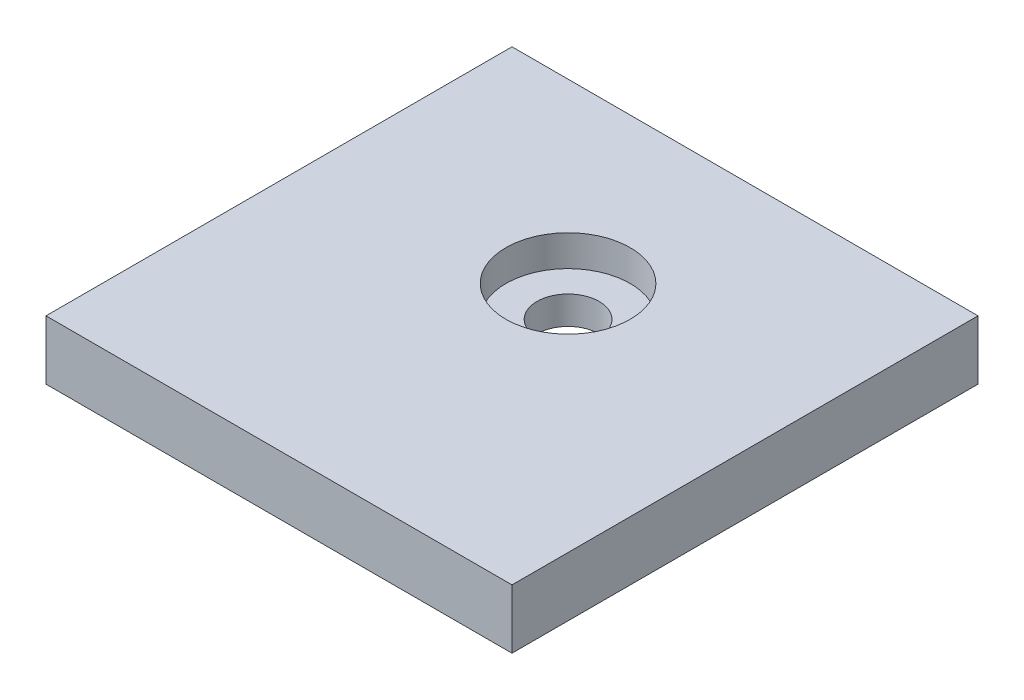
ISO-10303-21;
HEADER;
FILE_DESCRIPTION(('STEP AP214'),'2;1');
FILE_NAME('part.step','',(''),(''),'','','');
FILE_SCHEMA(('AUTOMOTIVE_DESIGN { 1 0 10303 214 1 1 1 1 }'));
ENDSEC;
DATA;
#1=APPLICATION_CONTEXT('core data for automotive mechanical design processes');
#2=APPLICATION_PROTOCOL_DEFINITION('international standard','automotive_design',2000,#1);
#3=PRODUCT_CONTEXT('',#1,'mechanical');
#4=PRODUCT('Part','Part','',(#3));
#5=PRODUCT_RELATED_PRODUCT_CATEGORY('part','',(#4));
#6=PRODUCT_DEFINITION_FORMATION('','',#4);
#7=PRODUCT_DEFINITION_CONTEXT('part definition',#1,'design');
#8=PRODUCT_DEFINITION('design','',#6,#7);
#9=PRODUCT_DEFINITION_SHAPE('','',#8);
#10=(LENGTH_UNIT() NAMED_UNIT(*) SI_UNIT(.MILLI.,.METRE.));
#11=(NAMED_UNIT(*) PLANE_ANGLE_UNIT() SI_UNIT($,.RADIAN.));
#12=(NAMED_UNIT(*) SI_UNIT($,.STERADIAN.) SOLID_ANGLE_UNIT());
#13=UNCERTAINTY_MEASURE_WITH_UNIT(LENGTH_MEASURE(1.E-05),#10,'distance_accuracy_value','');
#14=(GEOMETRIC_REPRESENTATION_CONTEXT(3) GLOBAL_UNCERTAINTY_ASSIGNED_CONTEXT((#13)) GLOBAL_UNIT_ASSIGNED_CONTEXT((#10,
#11,#12)) REPRESENTATION_CONTEXT('',''));
#15=CARTESIAN_POINT('',(0.,0.,0.));
#16=DIRECTION('',(0.,0.,1.));
#17=DIRECTION('',(1.,0.,0.));
#18=AXIS2_PLACEMENT_3D('',#15,#16,#17);
#19=CARTESIAN_POINT('',(0.,9.525,-9.02225882315077));
#20=DIRECTION('',(0.,-1.,0.));
#21=DIRECTION('',(0.,0.,-1.));
#22=AXIS2_PLACEMENT_3D('',#19,#20,#21);
#23=CYLINDRICAL_SURFACE('',#22,5.);
#24=CARTESIAN_POINT('',(0.,0.,-9.02225882315077));
#25=DIRECTION('',(0.,1.,0.));
#26=DIRECTION('',(0.,0.,1.));
#27=AXIS2_PLACEMENT_3D('',#24,#25,#26);
#28=CIRCLE('',#27,5.);
#29=CARTESIAN_POINT('',(0.,0.,-14.0222588231508));
#30=VERTEX_POINT('',#29);
#31=EDGE_CURVE('E102',#30,#30,#28,.T.);
#32=CARTESIAN_POINT('',(0.,4.525,-9.02225882315077));
#33=DIRECTION('',(0.,1.,0.));
#34=DIRECTION('',(0.,0.,1.));
#35=AXIS2_PLACEMENT_3D('',#32,#33,#34);
#36=CIRCLE('',#35,5.);
#37=CARTESIAN_POINT('',(0.,4.525,-14.0222588231508));
#38=VERTEX_POINT('',#37);
#39=EDGE_CURVE('E37',#38,#38,#36,.T.);
#40=CARTESIAN_POINT('',(0.,0.,-14.0222588231508));
#41=CARTESIAN_POINT('',(0.,0.0471354166666667,-14.0222588231508));
#42=CARTESIAN_POINT('',(0.,0.0942708333333334,-14.0222588231508));
#43=CARTESIAN_POINT('',(0.,0.188541666666667,-14.0222588231508));
#44=CARTESIAN_POINT('',(0.,0.235677083333333,-14.0222588231508));
#45=CARTESIAN_POINT('',(0.,0.329947916666667,-14.0222588231508));
#46=CARTESIAN_POINT('',(0.,0.377083333333333,-14.0222588231508));
#47=CARTESIAN_POINT('',(0.,0.471354166666667,-14.0222588231508));
#48=CARTESIAN_POINT('',(0.,0.518489583333334,-14.0222588231508));
#49=CARTESIAN_POINT('',(0.,0.612760416666667,-14.0222588231508));
#50=CARTESIAN_POINT('',(0.,0.659895833333334,-14.0222588231508));
#51=CARTESIAN_POINT('',(0.,0.754166666666667,-14.0222588231508));
#52=CARTESIAN_POINT('',(0.,0.801302083333334,-14.0222588231508));
#53=CARTESIAN_POINT('',(0.,0.895572916666667,-14.0222588231508));
#54=CARTESIAN_POINT('',(0.,0.942708333333334,-14.0222588231508));
#55=CARTESIAN_POINT('',(0.,1.03697916666667,-14.0222588231508));
#56=CARTESIAN_POINT('',(0.,1.08411458333333,-14.0222588231508));
#57=CARTESIAN_POINT('',(0.,1.17838541666667,-14.0222588231508));
#58=CARTESIAN_POINT('',(0.,1.22552083333333,-14.0222588231508));
#59=CARTESIAN_POINT('',(0.,1.31979166666667,-14.0222588231508));
#60=CARTESIAN_POINT('',(0.,1.36692708333333,-14.0222588231508));
#61=CARTESIAN_POINT('',(0.,1.46119791666667,-14.0222588231508));
#62=CARTESIAN_POINT('',(0.,1.50833333333333,-14.0222588231508));
#63=CARTESIAN_POINT('',(0.,1.60260416666667,-14.0222588231508));
#64=CARTESIAN_POINT('',(0.,1.64973958333333,-14.0222588231508));
#65=CARTESIAN_POINT('',(0.,1.74401041666667,-14.0222588231508));
#66=CARTESIAN_POINT('',(0.,1.79114583333333,-14.0222588231508));
#67=CARTESIAN_POINT('',(0.,1.88541666666667,-14.0222588231508));
#68=CARTESIAN_POINT('',(0.,1.93255208333333,-14.0222588231508));
#69=CARTESIAN_POINT('',(0.,2.02682291666667,-14.0222588231508));
#70=CARTESIAN_POINT('',(0.,2.07395833333333,-14.0222588231508));
#71=CARTESIAN_POINT('',(0.,2.16822916666667,-14.0222588231508));
#72=CARTESIAN_POINT('',(0.,2.21536458333333,-14.0222588231508));
#73=CARTESIAN_POINT('',(0.,2.30963541666667,-14.0222588231508));
#74=CARTESIAN_POINT('',(0.,2.35677083333333,-14.0222588231508));
#75=CARTESIAN_POINT('',(0.,2.45104166666667,-14.0222588231508));
#76=CARTESIAN_POINT('',(0.,2.49817708333333,-14.0222588231508));
#77=CARTESIAN_POINT('',(0.,2.59244791666667,-14.0222588231508));
#78=CARTESIAN_POINT('',(0.,2.63958333333333,-14.0222588231508));
#79=CARTESIAN_POINT('',(0.,2.73385416666667,-14.0222588231508));
#80=CARTESIAN_POINT('',(0.,2.78098958333333,-14.0222588231508));
#81=CARTESIAN_POINT('',(0.,2.87526041666667,-14.0222588231508));
#82=CARTESIAN_POINT('',(0.,2.92239583333333,-14.0222588231508));
#83=CARTESIAN_POINT('',(0.,3.01666666666667,-14.0222588231508));
#84=CARTESIAN_POINT('',(0.,3.06380208333333,-14.0222588231508));
#85=CARTESIAN_POINT('',(0.,3.15807291666667,-14.0222588231508));
#86=CARTESIAN_POINT('',(0.,3.20520833333333,-14.0222588231508));
#87=CARTESIAN_POINT('',(0.,3.29947916666667,-14.0222588231508));
#88=CARTESIAN_POINT('',(0.,3.34661458333333,-14.0222588231508));
#89=CARTESIAN_POINT('',(0.,3.44088541666667,-14.0222588231508));
#90=CARTESIAN_POINT('',(0.,3.48802083333333,-14.0222588231508));
#91=CARTESIAN_POINT('',(0.,3.58229166666667,-14.0222588231508));
#92=CARTESIAN_POINT('',(0.,3.62942708333333,-14.0222588231508));
#93=CARTESIAN_POINT('',(0.,3.72369791666667,-14.0222588231508));
#94=CARTESIAN_POINT('',(0.,3.77083333333333,-14.0222588231508));
#95=CARTESIAN_POINT('',(0.,3.86510416666667,-14.0222588231508));
#96=CARTESIAN_POINT('',(0.,3.91223958333333,-14.0222588231508));
#97=CARTESIAN_POINT('',(0.,4.00651041666667,-14.0222588231508));
#98=CARTESIAN_POINT('',(0.,4.05364583333333,-14.0222588231508));
#99=CARTESIAN_POINT('',(0.,4.14791666666667,-14.0222588231508));
#100=CARTESIAN_POINT('',(0.,4.19505208333333,-14.0222588231508));
#101=CARTESIAN_POINT('',(0.,4.28932291666667,-14.0222588231508));
#102=CARTESIAN_POINT('',(0.,4.33645833333333,-14.0222588231508));
#103=CARTESIAN_POINT('',(0.,4.43072916666667,-14.0222588231508));
#104=CARTESIAN_POINT('',(0.,4.47786458333333,-14.0222588231508));
#105=CARTESIAN_POINT('',(0.,4.525,-14.0222588231508));
#106=B_SPLINE_CURVE_WITH_KNOTS('',3,(#40,#41,#42,#43,#44,#45,#46,#47,#48,#49,#50,#51,#52,#53,
#54,#55,#56,#57,#58,#59,#60,#61,#62,#63,#64,#65,#66,#67,#68,#69,#70,#71,#72,#73,#74,#75,#76,#77,
#78,#79,#80,#81,#82,#83,#84,#85,#86,#87,#88,#89,#90,#91,#92,#93,#94,#95,#96,#97,#98,#99,#100,
#101,#102,#103,#104,#105),.UNSPECIFIED.,.F.,.F.,(4,2,2,2,2,2,2,2,2,2,2,2,2,2,2,2,2,2,2,2,2,2,2,
2,2,2,2,2,2,2,2,2,4),(0.,0.14140625,0.2828125,0.42421875,0.565625,0.70703125,0.8484375,
0.98984375,1.13125,1.27265625,1.4140625,1.55546875,1.696875,1.83828125,1.9796875,2.12109375,
2.2625,2.40390625,2.5453125,2.68671875,2.828125,2.96953125,3.1109375,3.25234375,3.39375,
3.53515625,3.6765625,3.81796875,3.959375,4.10078125,4.2421875,4.38359375,4.525),.UNSPECIFIED.);
#107=EDGE_CURVE('BSEAM33',#30,#38,#106,.T.);
#108=ORIENTED_EDGE('',*,*,#31,.F.);
#109=ORIENTED_EDGE('',*,*,#39,.T.);
#110=ORIENTED_EDGE('',*,*,#107,.T.);
#111=ORIENTED_EDGE('',*,*,#107,.F.);
#112=EDGE_LOOP('',(#108,#110,#109,#111));
#113=FACE_BOUND('',#112,.T.);
#114=ADVANCED_FACE('F33',(#113),#23,.F.);
#115=CARTESIAN_POINT('',(0.,9.525,0.));
#116=DIRECTION('',(0.,1.,0.));
#117=DIRECTION('',(0.,0.,1.));
#118=AXIS2_PLACEMENT_3D('',#115,#116,#117);
#119=PLANE('',#118);
#120=CARTESIAN_POINT('',(0.,9.525,-9.02225882315077));
#121=DIRECTION('',(0.,1.,0.));
#122=DIRECTION('',(0.,0.,1.));
#123=AXIS2_PLACEMENT_3D('',#120,#121,#122);
#124=CIRCLE('',#123,10.);
#125=CARTESIAN_POINT('',(0.,9.525,0.977741176849227));
#126=VERTEX_POINT('',#125);
#127=EDGE_CURVE('E116',#126,#126,#124,.T.);
#128=ORIENTED_EDGE('',*,*,#127,.F.);
#129=EDGE_LOOP('',(#128));
#130=FACE_BOUND('',#129,.T.);
#131=DIRECTION('',(0.,0.,1.));
#132=VECTOR('',#131,1.);
#133=CARTESIAN_POINT('',(-37.5,9.525,37.5));
#134=LINE('',#133,#132);
#135=CARTESIAN_POINT('',(-37.5,9.525,-37.5));
#136=VERTEX_POINT('',#135);
#137=CARTESIAN_POINT('',(-37.5,9.525,37.5));
#138=VERTEX_POINT('',#137);
#139=EDGE_CURVE('E86',#136,#138,#134,.T.);
#140=ORIENTED_EDGE('',*,*,#139,.T.);
#141=DIRECTION('',(1.,0.,0.));
#142=VECTOR('',#141,1.);
#143=CARTESIAN_POINT('',(37.5,9.525,37.5));
#144=LINE('',#143,#142);
#145=CARTESIAN_POINT('',(37.5,9.525,37.5));
#146=VERTEX_POINT('',#145);
#147=EDGE_CURVE('E81',#138,#146,#144,.T.);
#148=ORIENTED_EDGE('',*,*,#147,.T.);
#149=DIRECTION('',(0.,0.,-1.));
#150=VECTOR('',#149,1.);
#151=CARTESIAN_POINT('',(37.5,9.525,37.5));
#152=LINE('',#151,#150);
#153=CARTESIAN_POINT('',(37.5,9.525,-37.5));
#154=VERTEX_POINT('',#153);
#155=EDGE_CURVE('E84',#146,#154,#152,.T.);
#156=ORIENTED_EDGE('',*,*,#155,.T.);
#157=DIRECTION('',(-1.,0.,0.));
#158=VECTOR('',#157,1.);
#159=CARTESIAN_POINT('',(37.5,9.525,-37.5));
#160=LINE('',#159,#158);
#161=EDGE_CURVE('E51',#154,#136,#160,.T.);
#162=ORIENTED_EDGE('',*,*,#161,.T.);
#163=EDGE_LOOP('',(#140,#148,#156,#162));
#164=FACE_BOUND('',#163,.T.);
#165=ADVANCED_FACE('F82',(#130,#164),#119,.T.);
#166=CARTESIAN_POINT('',(0.,0.,0.));
#167=DIRECTION('',(0.,1.,0.));
#168=DIRECTION('',(0.,0.,1.));
#169=AXIS2_PLACEMENT_3D('',#166,#167,#168);
#170=PLANE('',#169);
#171=DIRECTION('',(0.,0.,1.));
#172=VECTOR('',#171,1.);
#173=CARTESIAN_POINT('',(-37.5,0.,37.5));
#174=LINE('',#173,#172);
#175=CARTESIAN_POINT('',(-37.5,0.,-37.5));
#176=VERTEX_POINT('',#175);
#177=CARTESIAN_POINT('',(-37.5,0.,37.5));
#178=VERTEX_POINT('',#177);
#179=EDGE_CURVE('E99',#176,#178,#174,.T.);
#180=ORIENTED_EDGE('',*,*,#179,.F.);
#181=DIRECTION('',(-1.,0.,0.));
#182=VECTOR('',#181,1.);
#183=CARTESIAN_POINT('',(37.5,0.,-37.5));
#184=LINE('',#183,#182);
#185=CARTESIAN_POINT('',(37.5,0.,-37.5));
#186=VERTEX_POINT('',#185);
#187=EDGE_CURVE('E74',#186,#176,#184,.T.);
#188=ORIENTED_EDGE('',*,*,#187,.F.);
#189=DIRECTION('',(0.,0.,-1.));
#190=VECTOR('',#189,1.);
#191=CARTESIAN_POINT('',(37.5,0.,37.5));
#192=LINE('',#191,#190);
#193=CARTESIAN_POINT('',(37.5,0.,37.5));
#194=VERTEX_POINT('',#193);
#195=EDGE_CURVE('E68',#194,#186,#192,.T.);
#196=ORIENTED_EDGE('',*,*,#195,.F.);
#197=DIRECTION('',(1.,0.,0.));
#198=VECTOR('',#197,1.);
#199=CARTESIAN_POINT('',(37.5,0.,37.5));
#200=LINE('',#199,#198);
#201=EDGE_CURVE('E90',#178,#194,#200,.T.);
#202=ORIENTED_EDGE('',*,*,#201,.F.);
#203=EDGE_LOOP('',(#180,#188,#196,#202));
#204=FACE_BOUND('',#203,.T.);
#205=ORIENTED_EDGE('',*,*,#31,.T.);
#206=EDGE_LOOP('',(#205));
#207=FACE_BOUND('',#206,.T.);
#208=ADVANCED_FACE('F110',(#204,#207),#170,.F.);
#209=CARTESIAN_POINT('',(-37.5,9.525,37.5));
#210=DIRECTION('',(1.,0.,0.));
#211=DIRECTION('',(0.,0.,-1.));
#212=AXIS2_PLACEMENT_3D('',#209,#210,#211);
#213=PLANE('',#212);
#214=ORIENTED_EDGE('',*,*,#179,.T.);
#215=DIRECTION('',(0.,-1.,0.));
#216=VECTOR('',#215,1.);
#217=CARTESIAN_POINT('',(-37.5,9.525,37.5));
#218=LINE('',#217,#216);
#219=EDGE_CURVE('E11',#138,#178,#218,.T.);
#220=ORIENTED_EDGE('',*,*,#219,.F.);
#221=ORIENTED_EDGE('',*,*,#139,.F.);
#222=DIRECTION('',(0.,-1.,0.));
#223=VECTOR('',#222,1.);
#224=CARTESIAN_POINT('',(-37.5,9.525,-37.5));
#225=LINE('',#224,#223);
#226=EDGE_CURVE('E95',#136,#176,#225,.T.);
#227=ORIENTED_EDGE('',*,*,#226,.T.);
#228=EDGE_LOOP('',(#214,#220,#221,#227));
#229=FACE_BOUND('',#228,.T.);
#230=ADVANCED_FACE('F35',(#229),#213,.F.);
#231=CARTESIAN_POINT('',(37.5,9.525,37.5));
#232=DIRECTION('',(0.,0.,-1.));
#233=DIRECTION('',(-1.,0.,0.));
#234=AXIS2_PLACEMENT_3D('',#231,#232,#233);
#235=PLANE('',#234);
#236=ORIENTED_EDGE('',*,*,#201,.T.);
#237=DIRECTION('',(0.,-1.,0.));
#238=VECTOR('',#237,1.);
#239=CARTESIAN_POINT('',(37.5,9.525,37.5));
#240=LINE('',#239,#238);
#241=EDGE_CURVE('E43',#146,#194,#240,.T.);
#242=ORIENTED_EDGE('',*,*,#241,.F.);
#243=ORIENTED_EDGE('',*,*,#147,.F.);
#244=ORIENTED_EDGE('',*,*,#219,.T.);
#245=EDGE_LOOP('',(#236,#242,#243,#244));
#246=FACE_BOUND('',#245,.T.);
#247=ADVANCED_FACE('F89',(#246),#235,.F.);
#248=CARTESIAN_POINT('',(37.5,9.525,37.5));
#249=DIRECTION('',(-1.,0.,0.));
#250=DIRECTION('',(0.,0.,1.));
#251=AXIS2_PLACEMENT_3D('',#248,#249,#250);
#252=PLANE('',#251);
#253=ORIENTED_EDGE('',*,*,#195,.T.);
#254=DIRECTION('',(0.,-1.,0.));
#255=VECTOR('',#254,1.);
#256=CARTESIAN_POINT('',(37.5,9.525,-37.5));
#257=LINE('',#256,#255);
#258=EDGE_CURVE('E91',#154,#186,#257,.T.);
#259=ORIENTED_EDGE('',*,*,#258,.F.);
#260=ORIENTED_EDGE('',*,*,#155,.F.);
#261=ORIENTED_EDGE('',*,*,#241,.T.);
#262=EDGE_LOOP('',(#253,#259,#260,#261));
#263=FACE_BOUND('',#262,.T.);
#264=ADVANCED_FACE('F93',(#263),#252,.F.);
#265=CARTESIAN_POINT('',(37.5,9.525,-37.5));
#266=DIRECTION('',(0.,0.,1.));
#267=DIRECTION('',(1.,0.,0.));
#268=AXIS2_PLACEMENT_3D('',#265,#266,#267);
#269=PLANE('',#268);
#270=ORIENTED_EDGE('',*,*,#187,.T.);
#271=ORIENTED_EDGE('',*,*,#226,.F.);
#272=ORIENTED_EDGE('',*,*,#161,.F.);
#273=ORIENTED_EDGE('',*,*,#258,.T.);
#274=EDGE_LOOP('',(#270,#271,#272,#273));
#275=FACE_BOUND('',#274,.T.);
#276=ADVANCED_FACE('F107',(#275),#269,.F.);
#277=CARTESIAN_POINT('',(0.,4.525,-9.02225882315077));
#278=DIRECTION('',(0.,1.,0.));
#279=DIRECTION('',(0.,0.,1.));
#280=AXIS2_PLACEMENT_3D('',#277,#278,#279);
#281=CYLINDRICAL_SURFACE('',#280,10.);
#282=CARTESIAN_POINT('',(0.,4.525,-9.02225882315077));
#283=DIRECTION('',(0.,1.,0.));
#284=DIRECTION('',(0.,0.,1.));
#285=AXIS2_PLACEMENT_3D('',#282,#283,#284);
#286=CIRCLE('',#285,10.);
#287=CARTESIAN_POINT('',(0.,4.525,0.977741176849227));
#288=VERTEX_POINT('',#287);
#289=EDGE_CURVE('E119',#288,#288,#286,.T.);
#290=ORIENTED_EDGE('',*,*,#289,.F.);
#291=EDGE_LOOP('',(#290));
#292=FACE_BOUND('',#291,.T.);
#293=ORIENTED_EDGE('',*,*,#127,.T.);
#294=EDGE_LOOP('',(#293));
#295=FACE_BOUND('',#294,.T.);
#296=ADVANCED_FACE('F129',(#292,#295),#281,.F.);
#297=CARTESIAN_POINT('',(0.,4.525,-9.02225882315077));
#298=DIRECTION('',(0.,1.,0.));
#299=DIRECTION('',(0.,0.,1.));
#300=AXIS2_PLACEMENT_3D('',#297,#298,#299);
#301=PLANE('',#300);
#302=ORIENTED_EDGE('',*,*,#39,.F.);
#303=EDGE_LOOP('',(#302));
#304=FACE_BOUND('',#303,.T.);
#305=ORIENTED_EDGE('',*,*,#289,.T.);
#306=EDGE_LOOP('',(#305));
#307=FACE_BOUND('',#306,.T.);
#308=ADVANCED_FACE('F127',(#304,#307),#301,.T.);
#309=CLOSED_SHELL('',(#114,#165,#208,#230,#247,#264,#276,#296,#308));
#310=MANIFOLD_SOLID_BREP('B2',#309);
#311=ADVANCED_BREP_SHAPE_REPRESENTATION('',(#18,#310),#14);
#312=SHAPE_DEFINITION_REPRESENTATION(#9,#311);
ENDSEC;
END-ISO-10303-21;
